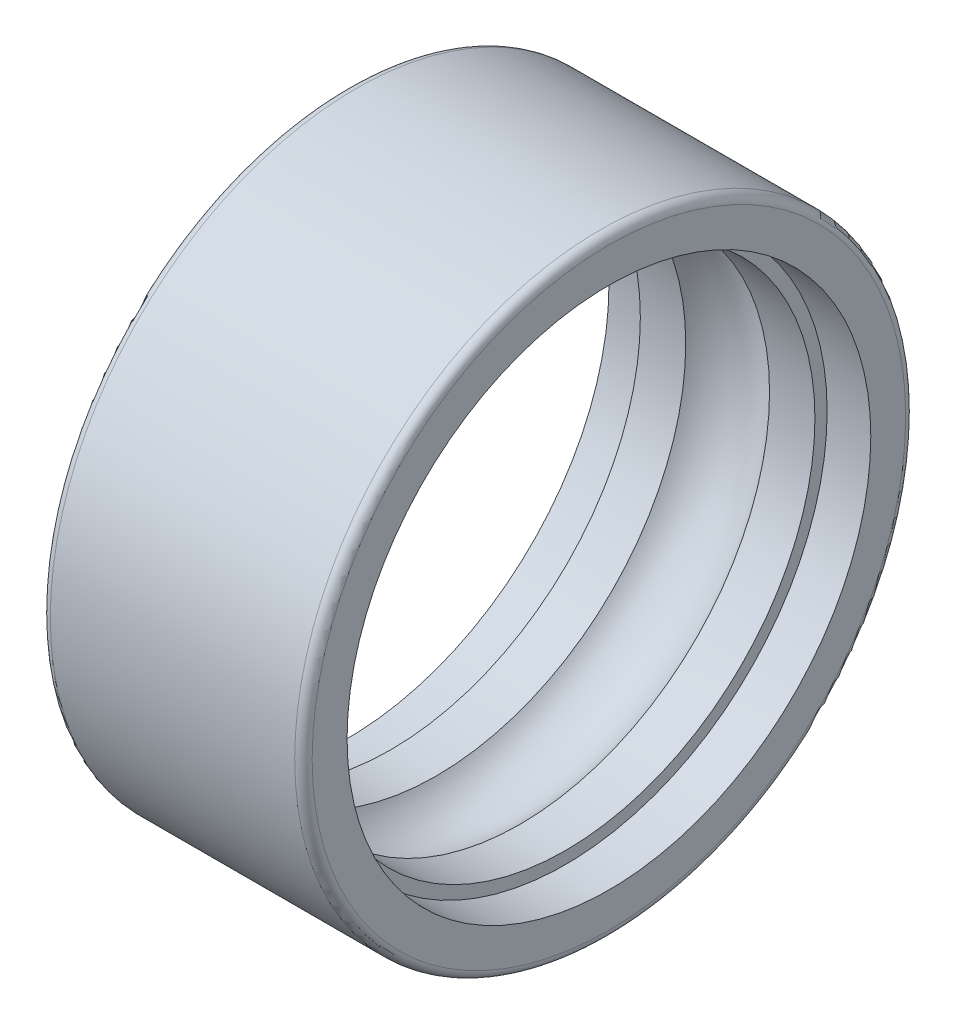
ISO-10303-21;
HEADER;
FILE_DESCRIPTION(('STEP AP214'),'2;1');
FILE_NAME('part.step','',(''),(''),'','','');
FILE_SCHEMA(('AUTOMOTIVE_DESIGN { 1 0 10303 214 1 1 1 1 }'));
ENDSEC;
DATA;
#1=APPLICATION_CONTEXT('core data for automotive mechanical design processes');
#2=APPLICATION_PROTOCOL_DEFINITION('international standard','automotive_design',2000,#1);
#3=PRODUCT_CONTEXT('',#1,'mechanical');
#4=PRODUCT('Part','Part','',(#3));
#5=PRODUCT_RELATED_PRODUCT_CATEGORY('part','',(#4));
#6=PRODUCT_DEFINITION_FORMATION('','',#4);
#7=PRODUCT_DEFINITION_CONTEXT('part definition',#1,'design');
#8=PRODUCT_DEFINITION('design','',#6,#7);
#9=PRODUCT_DEFINITION_SHAPE('','',#8);
#10=(LENGTH_UNIT() NAMED_UNIT(*) SI_UNIT(.MILLI.,.METRE.));
#11=(NAMED_UNIT(*) PLANE_ANGLE_UNIT() SI_UNIT($,.RADIAN.));
#12=(NAMED_UNIT(*) SI_UNIT($,.STERADIAN.) SOLID_ANGLE_UNIT());
#13=UNCERTAINTY_MEASURE_WITH_UNIT(LENGTH_MEASURE(1.E-05),#10,'distance_accuracy_value','');
#14=(GEOMETRIC_REPRESENTATION_CONTEXT(3) GLOBAL_UNCERTAINTY_ASSIGNED_CONTEXT((#13)) GLOBAL_UNIT_ASSIGNED_CONTEXT((#10,
#11,#12)) REPRESENTATION_CONTEXT('',''));
#15=CARTESIAN_POINT('',(0.,0.,0.));
#16=DIRECTION('',(0.,0.,1.));
#17=DIRECTION('',(1.,0.,0.));
#18=AXIS2_PLACEMENT_3D('',#15,#16,#17);
#19=CARTESIAN_POINT('',(0.,-3.01,-3.01));
#20=DIRECTION('',(-1.,0.,0.));
#21=DIRECTION('',(0.,0.,1.));
#22=AXIS2_PLACEMENT_3D('',#19,#20,#21);
#23=PLANE('',#22);
#24=CARTESIAN_POINT('',(0.,0.,0.));
#25=DIRECTION('',(-1.,0.,0.));
#26=DIRECTION('',(0.,0.,1.));
#27=AXIS2_PLACEMENT_3D('',#24,#25,#26);
#28=CIRCLE('',#27,2.86);
#29=CARTESIAN_POINT('',(0.,0.,2.86));
#30=VERTEX_POINT('',#29);
#31=CARTESIAN_POINT('',(0.,0.,-2.86));
#32=VERTEX_POINT('',#31);
#33=EDGE_CURVE('E108',#30,#32,#28,.T.);
#34=ORIENTED_EDGE('',*,*,#33,.F.);
#35=CARTESIAN_POINT('',(0.,0.,0.));
#36=DIRECTION('',(-1.,0.,0.));
#37=DIRECTION('',(0.,0.,-1.));
#38=AXIS2_PLACEMENT_3D('',#35,#36,#37);
#39=CIRCLE('',#38,2.86);
#40=EDGE_CURVE('E104',#32,#30,#39,.T.);
#41=ORIENTED_EDGE('',*,*,#40,.F.);
#42=EDGE_LOOP('',(#34,#41));
#43=FACE_BOUND('',#42,.T.);
#44=CARTESIAN_POINT('',(0.,0.,0.));
#45=DIRECTION('',(-1.,0.,0.));
#46=DIRECTION('',(0.,0.,1.));
#47=AXIS2_PLACEMENT_3D('',#44,#45,#46);
#48=CIRCLE('',#47,3.);
#49=CARTESIAN_POINT('',(0.,0.,3.));
#50=VERTEX_POINT('',#49);
#51=CARTESIAN_POINT('',(0.,0.,-3.));
#52=VERTEX_POINT('',#51);
#53=EDGE_CURVE('E27',#50,#52,#48,.T.);
#54=ORIENTED_EDGE('',*,*,#53,.T.);
#55=CARTESIAN_POINT('',(0.,0.,0.));
#56=DIRECTION('',(-1.,0.,0.));
#57=DIRECTION('',(0.,0.,-1.));
#58=AXIS2_PLACEMENT_3D('',#55,#56,#57);
#59=CIRCLE('',#58,3.);
#60=EDGE_CURVE('E11',#52,#50,#59,.T.);
#61=ORIENTED_EDGE('',*,*,#60,.T.);
#62=EDGE_LOOP('',(#54,#61));
#63=FACE_BOUND('',#62,.T.);
#64=ADVANCED_FACE('F17',(#43,#63),#23,.T.);
#65=CARTESIAN_POINT('',(0.,0.,0.));
#66=DIRECTION('',(-1.,0.,0.));
#67=DIRECTION('',(0.,0.,1.));
#68=AXIS2_PLACEMENT_3D('',#65,#66,#67);
#69=CYLINDRICAL_SURFACE('',#68,3.);
#70=CARTESIAN_POINT('',(-0.5,0.,0.));
#71=DIRECTION('',(-1.,0.,0.));
#72=DIRECTION('',(0.,0.,1.));
#73=AXIS2_PLACEMENT_3D('',#70,#71,#72);
#74=CIRCLE('',#73,3.);
#75=CARTESIAN_POINT('',(-0.5,0.,3.));
#76=VERTEX_POINT('',#75);
#77=CARTESIAN_POINT('',(-0.5,0.,-3.));
#78=VERTEX_POINT('',#77);
#79=EDGE_CURVE('E148',#76,#78,#74,.T.);
#80=ORIENTED_EDGE('',*,*,#79,.T.);
#81=DIRECTION('',(1.,0.,0.));
#82=VECTOR('',#81,1.);
#83=CARTESIAN_POINT('',(-0.25,0.,-3.));
#84=LINE('',#83,#82);
#85=EDGE_CURVE('E271',#78,#52,#84,.T.);
#86=ORIENTED_EDGE('',*,*,#85,.T.);
#87=ORIENTED_EDGE('',*,*,#53,.F.);
#88=ORIENTED_EDGE('',*,*,#60,.F.);
#89=ORIENTED_EDGE('',*,*,#85,.F.);
#90=CARTESIAN_POINT('',(-0.5,0.,0.));
#91=DIRECTION('',(-1.,0.,0.));
#92=DIRECTION('',(0.,0.,-1.));
#93=AXIS2_PLACEMENT_3D('',#90,#91,#92);
#94=CIRCLE('',#93,3.);
#95=EDGE_CURVE('E146',#78,#76,#94,.T.);
#96=ORIENTED_EDGE('',*,*,#95,.T.);
#97=EDGE_LOOP('',(#80,#86,#87,#88,#89,#96));
#98=FACE_BOUND('',#97,.T.);
#99=ADVANCED_FACE('F208',(#98),#69,.F.);
#100=CARTESIAN_POINT('',(2.5,0.,0.));
#101=DIRECTION('',(-1.,0.,0.));
#102=DIRECTION('',(0.,0.,1.));
#103=AXIS2_PLACEMENT_3D('',#100,#101,#102);
#104=CYLINDRICAL_SURFACE('',#103,3.);
#105=CARTESIAN_POINT('',(2.,0.,0.));
#106=DIRECTION('',(-1.,0.,0.));
#107=DIRECTION('',(0.,0.,1.));
#108=AXIS2_PLACEMENT_3D('',#105,#106,#107);
#109=CIRCLE('',#108,3.);
#110=CARTESIAN_POINT('',(2.,0.,3.));
#111=VERTEX_POINT('',#110);
#112=CARTESIAN_POINT('',(2.,0.,-3.));
#113=VERTEX_POINT('',#112);
#114=EDGE_CURVE('E261',#111,#113,#109,.T.);
#115=ORIENTED_EDGE('',*,*,#114,.T.);
#116=DIRECTION('',(1.,0.,0.));
#117=VECTOR('',#116,1.);
#118=CARTESIAN_POINT('',(2.25,0.,-3.));
#119=LINE('',#118,#117);
#120=CARTESIAN_POINT('',(2.5,0.,-3.));
#121=VERTEX_POINT('',#120);
#122=EDGE_CURVE('E268',#113,#121,#119,.T.);
#123=ORIENTED_EDGE('',*,*,#122,.T.);
#124=CARTESIAN_POINT('',(2.5,0.,0.));
#125=DIRECTION('',(-1.,0.,0.));
#126=DIRECTION('',(0.,0.,1.));
#127=AXIS2_PLACEMENT_3D('',#124,#125,#126);
#128=CIRCLE('',#127,3.);
#129=CARTESIAN_POINT('',(2.5,0.,3.));
#130=VERTEX_POINT('',#129);
#131=EDGE_CURVE('E128',#130,#121,#128,.T.);
#132=ORIENTED_EDGE('',*,*,#131,.F.);
#133=CARTESIAN_POINT('',(2.5,0.,0.));
#134=DIRECTION('',(-1.,0.,0.));
#135=DIRECTION('',(0.,0.,-1.));
#136=AXIS2_PLACEMENT_3D('',#133,#134,#135);
#137=CIRCLE('',#136,3.);
#138=EDGE_CURVE('E117',#121,#130,#137,.T.);
#139=ORIENTED_EDGE('',*,*,#138,.F.);
#140=ORIENTED_EDGE('',*,*,#122,.F.);
#141=CARTESIAN_POINT('',(2.,0.,0.));
#142=DIRECTION('',(-1.,0.,0.));
#143=DIRECTION('',(0.,0.,-1.));
#144=AXIS2_PLACEMENT_3D('',#141,#142,#143);
#145=CIRCLE('',#144,3.);
#146=EDGE_CURVE('E265',#113,#111,#145,.T.);
#147=ORIENTED_EDGE('',*,*,#146,.T.);
#148=EDGE_LOOP('',(#115,#123,#132,#139,#140,#147));
#149=FACE_BOUND('',#148,.T.);
#150=ADVANCED_FACE('F213',(#149),#104,.F.);
#151=CARTESIAN_POINT('',(2.,-3.01,3.01));
#152=DIRECTION('',(1.,0.,0.));
#153=DIRECTION('',(0.,0.,-1.));
#154=AXIS2_PLACEMENT_3D('',#151,#152,#153);
#155=PLANE('',#154);
#156=CARTESIAN_POINT('',(2.,0.,0.));
#157=DIRECTION('',(-1.,0.,0.));
#158=DIRECTION('',(0.,0.,1.));
#159=AXIS2_PLACEMENT_3D('',#156,#157,#158);
#160=CIRCLE('',#159,2.86);
#161=CARTESIAN_POINT('',(2.,0.,2.86));
#162=VERTEX_POINT('',#161);
#163=CARTESIAN_POINT('',(2.,0.,-2.86));
#164=VERTEX_POINT('',#163);
#165=EDGE_CURVE('E254',#162,#164,#160,.T.);
#166=ORIENTED_EDGE('',*,*,#165,.T.);
#167=CARTESIAN_POINT('',(2.,0.,0.));
#168=DIRECTION('',(-1.,0.,0.));
#169=DIRECTION('',(0.,0.,-1.));
#170=AXIS2_PLACEMENT_3D('',#167,#168,#169);
#171=CIRCLE('',#170,2.86);
#172=EDGE_CURVE('E258',#164,#162,#171,.T.);
#173=ORIENTED_EDGE('',*,*,#172,.T.);
#174=EDGE_LOOP('',(#166,#173));
#175=FACE_BOUND('',#174,.T.);
#176=ORIENTED_EDGE('',*,*,#114,.F.);
#177=ORIENTED_EDGE('',*,*,#146,.F.);
#178=EDGE_LOOP('',(#176,#177));
#179=FACE_BOUND('',#178,.T.);
#180=ADVANCED_FACE('F218',(#175,#179),#155,.T.);
#181=CARTESIAN_POINT('',(2.,0.,0.));
#182=DIRECTION('',(-1.,0.,0.));
#183=DIRECTION('',(0.,0.,1.));
#184=AXIS2_PLACEMENT_3D('',#181,#182,#183);
#185=CYLINDRICAL_SURFACE('',#184,2.86);
#186=CARTESIAN_POINT('',(1.48,0.,0.));
#187=DIRECTION('',(-1.,0.,0.));
#188=DIRECTION('',(0.,0.,1.));
#189=AXIS2_PLACEMENT_3D('',#186,#187,#188);
#190=CIRCLE('',#189,2.86);
#191=CARTESIAN_POINT('',(1.48,0.,2.86));
#192=VERTEX_POINT('',#191);
#193=CARTESIAN_POINT('',(1.48,0.,-2.86));
#194=VERTEX_POINT('',#193);
#195=EDGE_CURVE('E243',#192,#194,#190,.T.);
#196=ORIENTED_EDGE('',*,*,#195,.T.);
#197=DIRECTION('',(1.,0.,0.));
#198=VECTOR('',#197,1.);
#199=CARTESIAN_POINT('',(1.74,0.,-2.86));
#200=LINE('',#199,#198);
#201=EDGE_CURVE('E250',#194,#164,#200,.T.);
#202=ORIENTED_EDGE('',*,*,#201,.T.);
#203=ORIENTED_EDGE('',*,*,#165,.F.);
#204=ORIENTED_EDGE('',*,*,#172,.F.);
#205=ORIENTED_EDGE('',*,*,#201,.F.);
#206=CARTESIAN_POINT('',(1.48,0.,0.));
#207=DIRECTION('',(-1.,0.,0.));
#208=DIRECTION('',(0.,0.,-1.));
#209=AXIS2_PLACEMENT_3D('',#206,#207,#208);
#210=CIRCLE('',#209,2.86);
#211=EDGE_CURVE('E247',#194,#192,#210,.T.);
#212=ORIENTED_EDGE('',*,*,#211,.T.);
#213=EDGE_LOOP('',(#196,#202,#203,#204,#205,#212));
#214=FACE_BOUND('',#213,.T.);
#215=ADVANCED_FACE('F222',(#214),#185,.F.);
#216=CARTESIAN_POINT('',(0.999999999999997,0.,0.));
#217=DIRECTION('',(-1.,0.,0.));
#218=DIRECTION('',(0.,0.,1.));
#219=AXIS2_PLACEMENT_3D('',#216,#217,#218);
#220=TOROIDAL_SURFACE('',#219,2.5,0.600000000000006);
#221=CARTESIAN_POINT('',(0.52,0.,0.));
#222=DIRECTION('',(-1.,0.,0.));
#223=DIRECTION('',(0.,0.,1.));
#224=AXIS2_PLACEMENT_3D('',#221,#222,#223);
#225=CIRCLE('',#224,2.86);
#226=CARTESIAN_POINT('',(0.52,0.,2.86));
#227=VERTEX_POINT('',#226);
#228=CARTESIAN_POINT('',(0.52,0.,-2.86));
#229=VERTEX_POINT('',#228);
#230=EDGE_CURVE('E125',#227,#229,#225,.T.);
#231=ORIENTED_EDGE('',*,*,#230,.T.);
#232=CARTESIAN_POINT('',(0.999999999999994,0.,-2.50000000000001));
#233=DIRECTION('',(0.,-1.,0.));
#234=DIRECTION('',(-0.800000000000004,0.,-0.599999999999994));
#235=AXIS2_PLACEMENT_3D('',#232,#233,#234);
#236=CIRCLE('',#235,0.59999999999999);
#237=EDGE_CURVE('E113',#229,#194,#236,.T.);
#238=ORIENTED_EDGE('',*,*,#237,.T.);
#239=ORIENTED_EDGE('',*,*,#195,.F.);
#240=ORIENTED_EDGE('',*,*,#211,.F.);
#241=ORIENTED_EDGE('',*,*,#237,.F.);
#242=CARTESIAN_POINT('',(0.52,0.,0.));
#243=DIRECTION('',(-1.,0.,0.));
#244=DIRECTION('',(0.,0.,-1.));
#245=AXIS2_PLACEMENT_3D('',#242,#243,#244);
#246=CIRCLE('',#245,2.86);
#247=EDGE_CURVE('E114',#229,#227,#246,.T.);
#248=ORIENTED_EDGE('',*,*,#247,.T.);
#249=EDGE_LOOP('',(#231,#238,#239,#240,#241,#248));
#250=FACE_BOUND('',#249,.T.);
#251=ADVANCED_FACE('F205',(#250),#220,.F.);
#252=CARTESIAN_POINT('',(0.52,0.,0.));
#253=DIRECTION('',(-1.,0.,0.));
#254=DIRECTION('',(0.,0.,1.));
#255=AXIS2_PLACEMENT_3D('',#252,#253,#254);
#256=CYLINDRICAL_SURFACE('',#255,2.86);
#257=ORIENTED_EDGE('',*,*,#33,.T.);
#258=DIRECTION('',(1.,0.,0.));
#259=VECTOR('',#258,1.);
#260=CARTESIAN_POINT('',(0.26,0.,-2.86));
#261=LINE('',#260,#259);
#262=EDGE_CURVE('E110',#32,#229,#261,.T.);
#263=ORIENTED_EDGE('',*,*,#262,.T.);
#264=ORIENTED_EDGE('',*,*,#230,.F.);
#265=ORIENTED_EDGE('',*,*,#247,.F.);
#266=ORIENTED_EDGE('',*,*,#262,.F.);
#267=ORIENTED_EDGE('',*,*,#40,.T.);
#268=EDGE_LOOP('',(#257,#263,#264,#265,#266,#267));
#269=FACE_BOUND('',#268,.T.);
#270=ADVANCED_FACE('F106',(#269),#256,.F.);
#271=CARTESIAN_POINT('',(2.5,-3.41,3.41));
#272=DIRECTION('',(1.,0.,0.));
#273=DIRECTION('',(0.,0.,-1.));
#274=AXIS2_PLACEMENT_3D('',#271,#272,#273);
#275=PLANE('',#274);
#276=ORIENTED_EDGE('',*,*,#131,.T.);
#277=ORIENTED_EDGE('',*,*,#138,.T.);
#278=EDGE_LOOP('',(#276,#277));
#279=FACE_BOUND('',#278,.T.);
#280=CARTESIAN_POINT('',(2.5,0.,0.));
#281=DIRECTION('',(-1.,0.,0.));
#282=DIRECTION('',(0.,0.,1.));
#283=AXIS2_PLACEMENT_3D('',#280,#281,#282);
#284=CIRCLE('',#283,3.4);
#285=CARTESIAN_POINT('',(2.5,0.,3.4));
#286=VERTEX_POINT('',#285);
#287=CARTESIAN_POINT('',(2.5,0.,-3.4));
#288=VERTEX_POINT('',#287);
#289=EDGE_CURVE('E135',#286,#288,#284,.T.);
#290=ORIENTED_EDGE('',*,*,#289,.F.);
#291=CARTESIAN_POINT('',(2.5,0.,0.));
#292=DIRECTION('',(-1.,0.,0.));
#293=DIRECTION('',(0.,0.,-1.));
#294=AXIS2_PLACEMENT_3D('',#291,#292,#293);
#295=CIRCLE('',#294,3.4);
#296=EDGE_CURVE('E138',#288,#286,#295,.T.);
#297=ORIENTED_EDGE('',*,*,#296,.F.);
#298=EDGE_LOOP('',(#290,#297));
#299=FACE_BOUND('',#298,.T.);
#300=ADVANCED_FACE('F195',(#279,#299),#275,.T.);
#301=CARTESIAN_POINT('',(2.4,0.,0.));
#302=DIRECTION('',(-1.,0.,0.));
#303=DIRECTION('',(0.,0.,1.));
#304=AXIS2_PLACEMENT_3D('',#301,#302,#303);
#305=TOROIDAL_SURFACE('',#304,3.4,0.0999999999999985);
#306=CARTESIAN_POINT('',(2.4,0.,0.));
#307=DIRECTION('',(1.,0.,0.));
#308=DIRECTION('',(0.,0.,1.));
#309=AXIS2_PLACEMENT_3D('',#306,#307,#308);
#310=CIRCLE('',#309,3.5);
#311=CARTESIAN_POINT('',(2.4,0.,3.5));
#312=VERTEX_POINT('',#311);
#313=CARTESIAN_POINT('',(2.4,0.,-3.5));
#314=VERTEX_POINT('',#313);
#315=EDGE_CURVE('E155',#312,#314,#310,.T.);
#316=ORIENTED_EDGE('',*,*,#315,.T.);
#317=CARTESIAN_POINT('',(2.4,0.,-3.4));
#318=DIRECTION('',(0.,-1.,0.));
#319=DIRECTION('',(0.,0.,-1.));
#320=AXIS2_PLACEMENT_3D('',#317,#318,#319);
#321=CIRCLE('',#320,0.0999999999999985);
#322=EDGE_CURVE('E142',#314,#288,#321,.T.);
#323=ORIENTED_EDGE('',*,*,#322,.T.);
#324=ORIENTED_EDGE('',*,*,#296,.T.);
#325=ORIENTED_EDGE('',*,*,#289,.T.);
#326=ORIENTED_EDGE('',*,*,#322,.F.);
#327=CARTESIAN_POINT('',(2.4,0.,0.));
#328=DIRECTION('',(1.,0.,0.));
#329=DIRECTION('',(0.,0.,-1.));
#330=AXIS2_PLACEMENT_3D('',#327,#328,#329);
#331=CIRCLE('',#330,3.5);
#332=EDGE_CURVE('E152',#314,#312,#331,.T.);
#333=ORIENTED_EDGE('',*,*,#332,.T.);
#334=EDGE_LOOP('',(#316,#323,#324,#325,#326,#333));
#335=FACE_BOUND('',#334,.T.);
#336=ADVANCED_FACE('F192',(#335),#305,.T.);
#337=CARTESIAN_POINT('',(-0.5,-3.41,-3.41));
#338=DIRECTION('',(-1.,0.,0.));
#339=DIRECTION('',(0.,0.,1.));
#340=AXIS2_PLACEMENT_3D('',#337,#338,#339);
#341=PLANE('',#340);
#342=ORIENTED_EDGE('',*,*,#79,.F.);
#343=ORIENTED_EDGE('',*,*,#95,.F.);
#344=EDGE_LOOP('',(#342,#343));
#345=FACE_BOUND('',#344,.T.);
#346=CARTESIAN_POINT('',(-0.5,0.,0.));
#347=DIRECTION('',(1.,0.,0.));
#348=DIRECTION('',(0.,0.,1.));
#349=AXIS2_PLACEMENT_3D('',#346,#347,#348);
#350=CIRCLE('',#349,3.4);
#351=CARTESIAN_POINT('',(-0.5,0.,3.4));
#352=VERTEX_POINT('',#351);
#353=CARTESIAN_POINT('',(-0.5,0.,-3.4));
#354=VERTEX_POINT('',#353);
#355=EDGE_CURVE('E21',#352,#354,#350,.T.);
#356=ORIENTED_EDGE('',*,*,#355,.F.);
#357=CARTESIAN_POINT('',(-0.5,0.,0.));
#358=DIRECTION('',(1.,0.,0.));
#359=DIRECTION('',(0.,0.,-1.));
#360=AXIS2_PLACEMENT_3D('',#357,#358,#359);
#361=CIRCLE('',#360,3.4);
#362=EDGE_CURVE('E162',#354,#352,#361,.T.);
#363=ORIENTED_EDGE('',*,*,#362,.F.);
#364=EDGE_LOOP('',(#356,#363));
#365=FACE_BOUND('',#364,.T.);
#366=ADVANCED_FACE('F185',(#345,#365),#341,.T.);
#367=CARTESIAN_POINT('',(-0.4,0.,0.));
#368=DIRECTION('',(1.,0.,0.));
#369=DIRECTION('',(0.,0.,-1.));
#370=AXIS2_PLACEMENT_3D('',#367,#368,#369);
#371=CYLINDRICAL_SURFACE('',#370,3.5);
#372=CARTESIAN_POINT('',(-0.4,0.,0.));
#373=DIRECTION('',(-1.,0.,0.));
#374=DIRECTION('',(0.,0.,1.));
#375=AXIS2_PLACEMENT_3D('',#372,#373,#374);
#376=CIRCLE('',#375,3.5);
#377=CARTESIAN_POINT('',(-0.4,0.,3.5));
#378=VERTEX_POINT('',#377);
#379=CARTESIAN_POINT('',(-0.4,0.,-3.5));
#380=VERTEX_POINT('',#379);
#381=EDGE_CURVE('E165',#378,#380,#376,.T.);
#382=ORIENTED_EDGE('',*,*,#381,.F.);
#383=CARTESIAN_POINT('',(-0.4,0.,0.));
#384=DIRECTION('',(-1.,0.,0.));
#385=DIRECTION('',(0.,0.,-1.));
#386=AXIS2_PLACEMENT_3D('',#383,#384,#385);
#387=CIRCLE('',#386,3.5);
#388=EDGE_CURVE('E169',#380,#378,#387,.T.);
#389=ORIENTED_EDGE('',*,*,#388,.F.);
#390=DIRECTION('',(1.,0.,0.));
#391=VECTOR('',#390,1.);
#392=CARTESIAN_POINT('',(1.,0.,-3.5));
#393=LINE('',#392,#391);
#394=EDGE_CURVE('E158',#380,#314,#393,.T.);
#395=ORIENTED_EDGE('',*,*,#394,.T.);
#396=ORIENTED_EDGE('',*,*,#315,.F.);
#397=ORIENTED_EDGE('',*,*,#332,.F.);
#398=ORIENTED_EDGE('',*,*,#394,.F.);
#399=EDGE_LOOP('',(#382,#389,#395,#396,#397,#398));
#400=FACE_BOUND('',#399,.T.);
#401=ADVANCED_FACE('F188',(#400),#371,.T.);
#402=CARTESIAN_POINT('',(-0.400000000000003,0.,0.));
#403=DIRECTION('',(-1.,0.,0.));
#404=DIRECTION('',(0.,0.,1.));
#405=AXIS2_PLACEMENT_3D('',#402,#403,#404);
#406=TOROIDAL_SURFACE('',#405,3.4,0.099999999999998);
#407=ORIENTED_EDGE('',*,*,#355,.T.);
#408=CARTESIAN_POINT('',(-0.400000000000003,0.,-3.4));
#409=DIRECTION('',(0.,-1.,0.));
#410=DIRECTION('',(-1.,0.,0.));
#411=AXIS2_PLACEMENT_3D('',#408,#409,#410);
#412=CIRCLE('',#411,0.099999999999998);
#413=EDGE_CURVE('E172',#354,#380,#412,.T.);
#414=ORIENTED_EDGE('',*,*,#413,.T.);
#415=ORIENTED_EDGE('',*,*,#388,.T.);
#416=ORIENTED_EDGE('',*,*,#381,.T.);
#417=ORIENTED_EDGE('',*,*,#413,.F.);
#418=ORIENTED_EDGE('',*,*,#362,.T.);
#419=EDGE_LOOP('',(#407,#414,#415,#416,#417,#418));
#420=FACE_BOUND('',#419,.T.);
#421=ADVANCED_FACE('F19',(#420),#406,.T.);
#422=CLOSED_SHELL('',(#64,#99,#150,#180,#215,#251,#270,#300,#336,#366,#401,#421));
#423=MANIFOLD_SOLID_BREP('B1',#422);
#424=ADVANCED_BREP_SHAPE_REPRESENTATION('',(#18,#423),#14);
#425=SHAPE_DEFINITION_REPRESENTATION(#9,#424);
ENDSEC;
END-ISO-10303-21;
